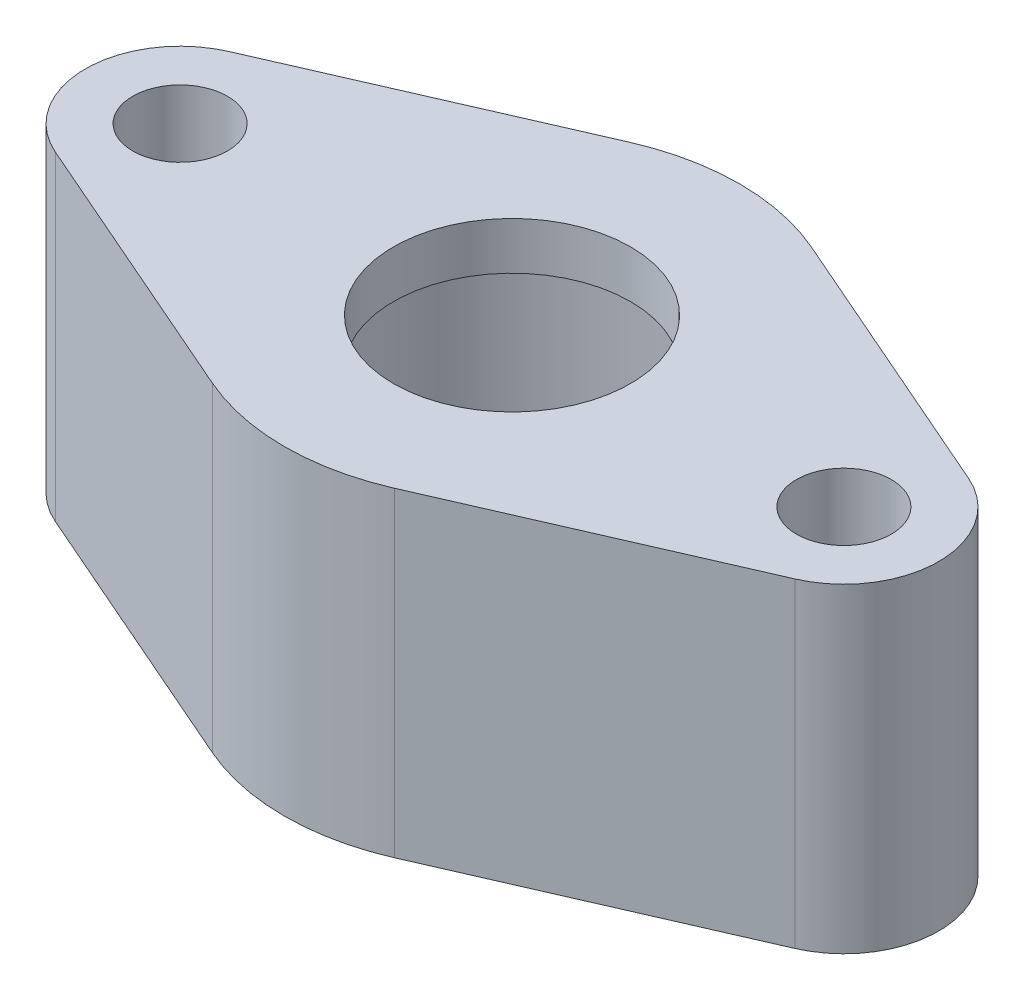
ISO-10303-21;
HEADER;
FILE_DESCRIPTION(('STEP AP214'),'2;1');
FILE_NAME('part.step','',(''),(''),'','','');
FILE_SCHEMA(('AUTOMOTIVE_DESIGN { 1 0 10303 214 1 1 1 1 }'));
ENDSEC;
DATA;
#1=APPLICATION_CONTEXT('core data for automotive mechanical design processes');
#2=APPLICATION_PROTOCOL_DEFINITION('international standard','automotive_design',2000,#1);
#3=PRODUCT_CONTEXT('',#1,'mechanical');
#4=PRODUCT('Part','Part','',(#3));
#5=PRODUCT_RELATED_PRODUCT_CATEGORY('part','',(#4));
#6=PRODUCT_DEFINITION_FORMATION('','',#4);
#7=PRODUCT_DEFINITION_CONTEXT('part definition',#1,'design');
#8=PRODUCT_DEFINITION('design','',#6,#7);
#9=PRODUCT_DEFINITION_SHAPE('','',#8);
#10=(LENGTH_UNIT() NAMED_UNIT(*) SI_UNIT(.MILLI.,.METRE.));
#11=(NAMED_UNIT(*) PLANE_ANGLE_UNIT() SI_UNIT($,.RADIAN.));
#12=(NAMED_UNIT(*) SI_UNIT($,.STERADIAN.) SOLID_ANGLE_UNIT());
#13=UNCERTAINTY_MEASURE_WITH_UNIT(LENGTH_MEASURE(1.E-05),#10,'distance_accuracy_value','');
#14=(GEOMETRIC_REPRESENTATION_CONTEXT(3) GLOBAL_UNCERTAINTY_ASSIGNED_CONTEXT((#13)) GLOBAL_UNIT_ASSIGNED_CONTEXT((#10,
#11,#12)) REPRESENTATION_CONTEXT('',''));
#15=CARTESIAN_POINT('',(0.,0.,0.));
#16=DIRECTION('',(0.,0.,1.));
#17=DIRECTION('',(1.,0.,0.));
#18=AXIS2_PLACEMENT_3D('',#15,#16,#17);
#19=CARTESIAN_POINT('',(-3.84,11.5,-8.79854533431522));
#20=DIRECTION('',(0.4,0.,0.916515138991168));
#21=DIRECTION('',(0.916515138991168,0.,-0.4));
#22=AXIS2_PLACEMENT_3D('',#19,#20,#21);
#23=PLANE('',#22);
#24=DIRECTION('',(-0.916515138991168,0.,0.4));
#25=VECTOR('',#24,1.);
#26=CARTESIAN_POINT('',(-3.84,0.,-8.79854533431522));
#27=LINE('',#26,#25);
#28=CARTESIAN_POINT('',(-3.84,0.,-8.79854533431522));
#29=VERTEX_POINT('',#28);
#30=CARTESIAN_POINT('',(-15.6,0.,-3.66606055596468));
#31=VERTEX_POINT('',#30);
#32=EDGE_CURVE('E143',#29,#31,#27,.T.);
#33=ORIENTED_EDGE('',*,*,#32,.T.);
#34=DIRECTION('',(0.,-1.,0.));
#35=VECTOR('',#34,1.);
#36=CARTESIAN_POINT('',(-15.6,11.5,-3.66606055596468));
#37=LINE('',#36,#35);
#38=CARTESIAN_POINT('',(-15.6,13.5,-3.66606055596468));
#39=VERTEX_POINT('',#38);
#40=EDGE_CURVE('E11',#39,#31,#37,.T.);
#41=ORIENTED_EDGE('',*,*,#40,.F.);
#42=DIRECTION('',(-0.916515138991168,0.,0.4));
#43=VECTOR('',#42,1.);
#44=CARTESIAN_POINT('',(-3.84,13.5,-8.79854533431522));
#45=LINE('',#44,#43);
#46=CARTESIAN_POINT('',(-3.84,13.5,-8.79854533431522));
#47=VERTEX_POINT('',#46);
#48=EDGE_CURVE('E105',#47,#39,#45,.T.);
#49=ORIENTED_EDGE('',*,*,#48,.F.);
#50=DIRECTION('',(0.,-1.,0.));
#51=VECTOR('',#50,1.);
#52=CARTESIAN_POINT('',(-3.84,11.5,-8.79854533431522));
#53=LINE('',#52,#51);
#54=EDGE_CURVE('E94',#47,#29,#53,.T.);
#55=ORIENTED_EDGE('',*,*,#54,.T.);
#56=EDGE_LOOP('',(#33,#41,#49,#55));
#57=FACE_BOUND('',#56,.T.);
#58=ADVANCED_FACE('F34',(#57),#23,.F.);
#59=CARTESIAN_POINT('',(-14.,11.5,0.));
#60=DIRECTION('',(0.,-1.,0.));
#61=DIRECTION('',(0.,0.,-1.));
#62=AXIS2_PLACEMENT_3D('',#59,#60,#61);
#63=CYLINDRICAL_SURFACE('',#62,4.);
#64=CARTESIAN_POINT('',(-14.,0.,0.));
#65=DIRECTION('',(0.,1.,0.));
#66=DIRECTION('',(0.,0.,1.));
#67=AXIS2_PLACEMENT_3D('',#64,#65,#66);
#68=CIRCLE('',#67,4.);
#69=CARTESIAN_POINT('',(-15.6,0.,3.66606055596467));
#70=VERTEX_POINT('',#69);
#71=EDGE_CURVE('E145',#31,#70,#68,.T.);
#72=ORIENTED_EDGE('',*,*,#71,.T.);
#73=DIRECTION('',(0.,-1.,0.));
#74=VECTOR('',#73,1.);
#75=CARTESIAN_POINT('',(-15.6,11.5,3.66606055596467));
#76=LINE('',#75,#74);
#77=CARTESIAN_POINT('',(-15.6,13.5,3.66606055596468));
#78=VERTEX_POINT('',#77);
#79=EDGE_CURVE('E42',#78,#70,#76,.T.);
#80=ORIENTED_EDGE('',*,*,#79,.F.);
#81=CARTESIAN_POINT('',(-14.,13.5,0.));
#82=DIRECTION('',(0.,1.,0.));
#83=DIRECTION('',(0.,0.,1.));
#84=AXIS2_PLACEMENT_3D('',#81,#82,#83);
#85=CIRCLE('',#84,4.);
#86=EDGE_CURVE('E109',#39,#78,#85,.T.);
#87=ORIENTED_EDGE('',*,*,#86,.F.);
#88=ORIENTED_EDGE('',*,*,#40,.T.);
#89=EDGE_LOOP('',(#72,#80,#87,#88));
#90=FACE_BOUND('',#89,.T.);
#91=ADVANCED_FACE('F190',(#90),#63,.T.);
#92=CARTESIAN_POINT('',(-3.84,11.5,8.79854533431521));
#93=DIRECTION('',(0.4,0.,-0.916515138991168));
#94=DIRECTION('',(-0.916515138991168,0.,-0.4));
#95=AXIS2_PLACEMENT_3D('',#92,#93,#94);
#96=PLANE('',#95);
#97=DIRECTION('',(0.916515138991168,0.,0.4));
#98=VECTOR('',#97,1.);
#99=CARTESIAN_POINT('',(-3.84,0.,8.79854533431521));
#100=LINE('',#99,#98);
#101=CARTESIAN_POINT('',(-3.84,0.,8.79854533431521));
#102=VERTEX_POINT('',#101);
#103=EDGE_CURVE('E147',#70,#102,#100,.T.);
#104=ORIENTED_EDGE('',*,*,#103,.T.);
#105=DIRECTION('',(0.,-1.,0.));
#106=VECTOR('',#105,1.);
#107=CARTESIAN_POINT('',(-3.84,11.5,8.79854533431521));
#108=LINE('',#107,#106);
#109=CARTESIAN_POINT('',(-3.84,13.5,8.79854533431521));
#110=VERTEX_POINT('',#109);
#111=EDGE_CURVE('E173',#110,#102,#108,.T.);
#112=ORIENTED_EDGE('',*,*,#111,.F.);
#113=DIRECTION('',(0.916515138991168,0.,0.4));
#114=VECTOR('',#113,1.);
#115=CARTESIAN_POINT('',(-15.6,13.5,3.66606055596467));
#116=LINE('',#115,#114);
#117=EDGE_CURVE('E125',#78,#110,#116,.T.);
#118=ORIENTED_EDGE('',*,*,#117,.F.);
#119=ORIENTED_EDGE('',*,*,#79,.T.);
#120=EDGE_LOOP('',(#104,#112,#118,#119));
#121=FACE_BOUND('',#120,.T.);
#122=ADVANCED_FACE('F179',(#121),#96,.F.);
#123=CARTESIAN_POINT('',(0.,11.5,0.));
#124=DIRECTION('',(0.,-1.,0.));
#125=DIRECTION('',(0.,0.,-1.));
#126=AXIS2_PLACEMENT_3D('',#123,#124,#125);
#127=CYLINDRICAL_SURFACE('',#126,9.6);
#128=CARTESIAN_POINT('',(0.,0.,0.));
#129=DIRECTION('',(0.,1.,0.));
#130=DIRECTION('',(0.,0.,1.));
#131=AXIS2_PLACEMENT_3D('',#128,#129,#130);
#132=CIRCLE('',#131,9.6);
#133=CARTESIAN_POINT('',(3.84,0.,8.79854533431521));
#134=VERTEX_POINT('',#133);
#135=EDGE_CURVE('E149',#102,#134,#132,.T.);
#136=ORIENTED_EDGE('',*,*,#135,.T.);
#137=DIRECTION('',(0.,-1.,0.));
#138=VECTOR('',#137,1.);
#139=CARTESIAN_POINT('',(3.84,11.5,8.79854533431521));
#140=LINE('',#139,#138);
#141=CARTESIAN_POINT('',(3.84,13.5,8.79854533431521));
#142=VERTEX_POINT('',#141);
#143=EDGE_CURVE('E171',#142,#134,#140,.T.);
#144=ORIENTED_EDGE('',*,*,#143,.F.);
#145=CARTESIAN_POINT('',(0.,13.5,0.));
#146=DIRECTION('',(0.,1.,0.));
#147=DIRECTION('',(0.,0.,1.));
#148=AXIS2_PLACEMENT_3D('',#145,#146,#147);
#149=CIRCLE('',#148,9.6);
#150=EDGE_CURVE('E128',#110,#142,#149,.T.);
#151=ORIENTED_EDGE('',*,*,#150,.F.);
#152=ORIENTED_EDGE('',*,*,#111,.T.);
#153=EDGE_LOOP('',(#136,#144,#151,#152));
#154=FACE_BOUND('',#153,.T.);
#155=ADVANCED_FACE('F187',(#154),#127,.T.);
#156=CARTESIAN_POINT('',(3.84,11.5,8.79854533431521));
#157=DIRECTION('',(0.4,0.,0.916515138991168));
#158=DIRECTION('',(0.916515138991168,0.,-0.4));
#159=AXIS2_PLACEMENT_3D('',#156,#157,#158);
#160=PLANE('',#159);
#161=DIRECTION('',(-0.916515138991168,0.,0.4));
#162=VECTOR('',#161,1.);
#163=CARTESIAN_POINT('',(3.84,0.,8.79854533431521));
#164=LINE('',#163,#162);
#165=CARTESIAN_POINT('',(15.6,0.,3.66606055596467));
#166=VERTEX_POINT('',#165);
#167=EDGE_CURVE('E152',#166,#134,#164,.T.);
#168=ORIENTED_EDGE('',*,*,#167,.F.);
#169=DIRECTION('',(0.,-1.,0.));
#170=VECTOR('',#169,1.);
#171=CARTESIAN_POINT('',(15.6,11.5,3.66606055596467));
#172=LINE('',#171,#170);
#173=CARTESIAN_POINT('',(15.6,13.5,3.66606055596467));
#174=VERTEX_POINT('',#173);
#175=EDGE_CURVE('E169',#174,#166,#172,.T.);
#176=ORIENTED_EDGE('',*,*,#175,.F.);
#177=DIRECTION('',(0.916515138991168,0.,-0.4));
#178=VECTOR('',#177,1.);
#179=CARTESIAN_POINT('',(3.84,13.5,8.79854533431521));
#180=LINE('',#179,#178);
#181=EDGE_CURVE('E131',#142,#174,#180,.T.);
#182=ORIENTED_EDGE('',*,*,#181,.F.);
#183=ORIENTED_EDGE('',*,*,#143,.T.);
#184=EDGE_LOOP('',(#168,#176,#182,#183));
#185=FACE_BOUND('',#184,.T.);
#186=ADVANCED_FACE('F199',(#185),#160,.T.);
#187=CARTESIAN_POINT('',(14.,11.5,0.));
#188=DIRECTION('',(0.,-1.,0.));
#189=DIRECTION('',(0.,0.,-1.));
#190=AXIS2_PLACEMENT_3D('',#187,#188,#189);
#191=CYLINDRICAL_SURFACE('',#190,4.);
#192=CARTESIAN_POINT('',(14.,0.,0.));
#193=DIRECTION('',(0.,1.,0.));
#194=DIRECTION('',(0.,0.,1.));
#195=AXIS2_PLACEMENT_3D('',#192,#193,#194);
#196=CIRCLE('',#195,4.);
#197=CARTESIAN_POINT('',(15.6,0.,-3.66606055596467));
#198=VERTEX_POINT('',#197);
#199=EDGE_CURVE('E155',#198,#166,#196,.F.);
#200=ORIENTED_EDGE('',*,*,#199,.F.);
#201=DIRECTION('',(0.,-1.,0.));
#202=VECTOR('',#201,1.);
#203=CARTESIAN_POINT('',(15.6,11.5,-3.66606055596467));
#204=LINE('',#203,#202);
#205=CARTESIAN_POINT('',(15.6,13.5,-3.66606055596467));
#206=VERTEX_POINT('',#205);
#207=EDGE_CURVE('E167',#206,#198,#204,.T.);
#208=ORIENTED_EDGE('',*,*,#207,.F.);
#209=CARTESIAN_POINT('',(14.,13.5,0.));
#210=DIRECTION('',(0.,1.,0.));
#211=DIRECTION('',(0.,0.,1.));
#212=AXIS2_PLACEMENT_3D('',#209,#210,#211);
#213=CIRCLE('',#212,4.);
#214=EDGE_CURVE('E134',#174,#206,#213,.T.);
#215=ORIENTED_EDGE('',*,*,#214,.F.);
#216=ORIENTED_EDGE('',*,*,#175,.T.);
#217=EDGE_LOOP('',(#200,#208,#215,#216));
#218=FACE_BOUND('',#217,.T.);
#219=ADVANCED_FACE('F197',(#218),#191,.T.);
#220=CARTESIAN_POINT('',(3.84,11.5,-8.79854533431521));
#221=DIRECTION('',(0.4,0.,-0.916515138991168));
#222=DIRECTION('',(-0.916515138991168,0.,-0.4));
#223=AXIS2_PLACEMENT_3D('',#220,#221,#222);
#224=PLANE('',#223);
#225=DIRECTION('',(0.916515138991168,0.,0.4));
#226=VECTOR('',#225,1.);
#227=CARTESIAN_POINT('',(3.84,0.,-8.79854533431521));
#228=LINE('',#227,#226);
#229=CARTESIAN_POINT('',(3.84,0.,-8.79854533431521));
#230=VERTEX_POINT('',#229);
#231=EDGE_CURVE('E158',#230,#198,#228,.T.);
#232=ORIENTED_EDGE('',*,*,#231,.F.);
#233=DIRECTION('',(0.,-1.,0.));
#234=VECTOR('',#233,1.);
#235=CARTESIAN_POINT('',(3.84,11.5,-8.79854533431521));
#236=LINE('',#235,#234);
#237=CARTESIAN_POINT('',(3.84,13.5,-8.79854533431521));
#238=VERTEX_POINT('',#237);
#239=EDGE_CURVE('E54',#238,#230,#236,.T.);
#240=ORIENTED_EDGE('',*,*,#239,.F.);
#241=DIRECTION('',(-0.916515138991168,0.,-0.4));
#242=VECTOR('',#241,1.);
#243=CARTESIAN_POINT('',(15.6,13.5,-3.66606055596467));
#244=LINE('',#243,#242);
#245=EDGE_CURVE('E116',#206,#238,#244,.T.);
#246=ORIENTED_EDGE('',*,*,#245,.F.);
#247=ORIENTED_EDGE('',*,*,#207,.T.);
#248=EDGE_LOOP('',(#232,#240,#246,#247));
#249=FACE_BOUND('',#248,.T.);
#250=ADVANCED_FACE('F193',(#249),#224,.T.);
#251=CARTESIAN_POINT('',(0.,11.5,0.));
#252=DIRECTION('',(0.,-1.,0.));
#253=DIRECTION('',(0.,0.,-1.));
#254=AXIS2_PLACEMENT_3D('',#251,#252,#253);
#255=CYLINDRICAL_SURFACE('',#254,7.6);
#256=CARTESIAN_POINT('',(0.,11.5,0.));
#257=DIRECTION('',(0.,1.,0.));
#258=DIRECTION('',(0.,0.,1.));
#259=AXIS2_PLACEMENT_3D('',#256,#257,#258);
#260=CIRCLE('',#259,7.6);
#261=CARTESIAN_POINT('',(0.,11.5,7.6));
#262=VERTEX_POINT('',#261);
#263=EDGE_CURVE('E137',#262,#262,#260,.T.);
#264=ORIENTED_EDGE('',*,*,#263,.T.);
#265=EDGE_LOOP('',(#264));
#266=FACE_BOUND('',#265,.T.);
#267=CARTESIAN_POINT('',(0.,0.,0.));
#268=DIRECTION('',(0.,1.,0.));
#269=DIRECTION('',(0.,0.,1.));
#270=AXIS2_PLACEMENT_3D('',#267,#268,#269);
#271=CIRCLE('',#270,7.6);
#272=CARTESIAN_POINT('',(0.,0.,7.6));
#273=VERTEX_POINT('',#272);
#274=EDGE_CURVE('E161',#273,#273,#271,.T.);
#275=ORIENTED_EDGE('',*,*,#274,.F.);
#276=EDGE_LOOP('',(#275));
#277=FACE_BOUND('',#276,.T.);
#278=ADVANCED_FACE('F245',(#266,#277),#255,.F.);
#279=EDGE_CURVE('E49',#230,#29,#132,.T.);
#280=ORIENTED_EDGE('',*,*,#279,.T.);
#281=ORIENTED_EDGE('',*,*,#54,.F.);
#282=CARTESIAN_POINT('',(0.,13.5,0.));
#283=DIRECTION('',(0.,1.,0.));
#284=DIRECTION('',(0.,0.,1.));
#285=AXIS2_PLACEMENT_3D('',#282,#283,#284);
#286=CIRCLE('',#285,9.6);
#287=EDGE_CURVE('E98',#238,#47,#286,.T.);
#288=ORIENTED_EDGE('',*,*,#287,.F.);
#289=ORIENTED_EDGE('',*,*,#239,.T.);
#290=EDGE_LOOP('',(#280,#281,#288,#289));
#291=FACE_BOUND('',#290,.T.);
#292=ADVANCED_FACE('F96',(#291),#127,.T.);
#293=CARTESIAN_POINT('',(-14.,11.5,0.));
#294=DIRECTION('',(0.,-1.,0.));
#295=DIRECTION('',(0.,0.,-1.));
#296=AXIS2_PLACEMENT_3D('',#293,#294,#295);
#297=CYLINDRICAL_SURFACE('',#296,2.);
#298=CARTESIAN_POINT('',(-14.,0.,0.));
#299=DIRECTION('',(0.,1.,0.));
#300=DIRECTION('',(0.,0.,1.));
#301=AXIS2_PLACEMENT_3D('',#298,#299,#300);
#302=CIRCLE('',#301,2.);
#303=CARTESIAN_POINT('',(-14.,0.,2.));
#304=VERTEX_POINT('',#303);
#305=EDGE_CURVE('E140',#304,#304,#302,.T.);
#306=ORIENTED_EDGE('',*,*,#305,.F.);
#307=EDGE_LOOP('',(#306));
#308=FACE_BOUND('',#307,.T.);
#309=CARTESIAN_POINT('',(-14.,13.5,0.));
#310=DIRECTION('',(0.,1.,0.));
#311=DIRECTION('',(0.,0.,1.));
#312=AXIS2_PLACEMENT_3D('',#309,#310,#311);
#313=CIRCLE('',#312,2.);
#314=CARTESIAN_POINT('',(-14.,13.5,2.));
#315=VERTEX_POINT('',#314);
#316=EDGE_CURVE('E117',#315,#315,#313,.T.);
#317=ORIENTED_EDGE('',*,*,#316,.T.);
#318=EDGE_LOOP('',(#317));
#319=FACE_BOUND('',#318,.T.);
#320=ADVANCED_FACE('F36',(#308,#319),#297,.F.);
#321=CARTESIAN_POINT('',(14.,11.5,0.));
#322=DIRECTION('',(0.,-1.,0.));
#323=DIRECTION('',(0.,0.,-1.));
#324=AXIS2_PLACEMENT_3D('',#321,#322,#323);
#325=CYLINDRICAL_SURFACE('',#324,2.);
#326=CARTESIAN_POINT('',(14.,0.,0.));
#327=DIRECTION('',(0.,1.,0.));
#328=DIRECTION('',(0.,0.,1.));
#329=AXIS2_PLACEMENT_3D('',#326,#327,#328);
#330=CIRCLE('',#329,2.);
#331=CARTESIAN_POINT('',(14.,0.,2.));
#332=VERTEX_POINT('',#331);
#333=EDGE_CURVE('E102',#332,#332,#330,.F.);
#334=ORIENTED_EDGE('',*,*,#333,.T.);
#335=EDGE_LOOP('',(#334));
#336=FACE_BOUND('',#335,.T.);
#337=CARTESIAN_POINT('',(14.,13.5,0.));
#338=DIRECTION('',(0.,1.,0.));
#339=DIRECTION('',(0.,0.,1.));
#340=AXIS2_PLACEMENT_3D('',#337,#338,#339);
#341=CIRCLE('',#340,2.);
#342=CARTESIAN_POINT('',(14.,13.5,2.));
#343=VERTEX_POINT('',#342);
#344=EDGE_CURVE('E120',#343,#343,#341,.T.);
#345=ORIENTED_EDGE('',*,*,#344,.T.);
#346=EDGE_LOOP('',(#345));
#347=FACE_BOUND('',#346,.T.);
#348=ADVANCED_FACE('F264',(#336,#347),#325,.F.);
#349=CARTESIAN_POINT('',(0.,0.,0.));
#350=DIRECTION('',(0.,1.,0.));
#351=DIRECTION('',(0.,0.,1.));
#352=AXIS2_PLACEMENT_3D('',#349,#350,#351);
#353=PLANE('',#352);
#354=ORIENTED_EDGE('',*,*,#305,.T.);
#355=EDGE_LOOP('',(#354));
#356=FACE_BOUND('',#355,.T.);
#357=ORIENTED_EDGE('',*,*,#32,.F.);
#358=ORIENTED_EDGE('',*,*,#279,.F.);
#359=ORIENTED_EDGE('',*,*,#231,.T.);
#360=ORIENTED_EDGE('',*,*,#199,.T.);
#361=ORIENTED_EDGE('',*,*,#167,.T.);
#362=ORIENTED_EDGE('',*,*,#135,.F.);
#363=ORIENTED_EDGE('',*,*,#103,.F.);
#364=ORIENTED_EDGE('',*,*,#71,.F.);
#365=EDGE_LOOP('',(#357,#358,#359,#360,#361,#362,#363,#364));
#366=FACE_BOUND('',#365,.T.);
#367=ORIENTED_EDGE('',*,*,#274,.T.);
#368=EDGE_LOOP('',(#367));
#369=FACE_BOUND('',#368,.T.);
#370=ORIENTED_EDGE('',*,*,#333,.F.);
#371=EDGE_LOOP('',(#370));
#372=FACE_BOUND('',#371,.T.);
#373=ADVANCED_FACE('F183',(#356,#366,#369,#372),#353,.F.);
#374=CARTESIAN_POINT('',(0.,11.5,0.));
#375=DIRECTION('',(0.,1.,0.));
#376=DIRECTION('',(0.,0.,1.));
#377=AXIS2_PLACEMENT_3D('',#374,#375,#376);
#378=PLANE('',#377);
#379=CARTESIAN_POINT('',(0.,11.5,0.));
#380=DIRECTION('',(0.,1.,0.));
#381=DIRECTION('',(0.,0.,1.));
#382=AXIS2_PLACEMENT_3D('',#379,#380,#381);
#383=CIRCLE('',#382,5.);
#384=CARTESIAN_POINT('',(0.,11.5,5.));
#385=VERTEX_POINT('',#384);
#386=EDGE_CURVE('E326',#385,#385,#383,.T.);
#387=ORIENTED_EDGE('',*,*,#386,.T.);
#388=EDGE_LOOP('',(#387));
#389=FACE_BOUND('',#388,.T.);
#390=ORIENTED_EDGE('',*,*,#263,.F.);
#391=EDGE_LOOP('',(#390));
#392=FACE_BOUND('',#391,.T.);
#393=ADVANCED_FACE('F282',(#389,#392),#378,.F.);
#394=CARTESIAN_POINT('',(0.,13.5,0.));
#395=DIRECTION('',(0.,1.,0.));
#396=DIRECTION('',(0.,0.,1.));
#397=AXIS2_PLACEMENT_3D('',#394,#395,#396);
#398=PLANE('',#397);
#399=ORIENTED_EDGE('',*,*,#344,.F.);
#400=EDGE_LOOP('',(#399));
#401=FACE_BOUND('',#400,.T.);
#402=ORIENTED_EDGE('',*,*,#287,.T.);
#403=ORIENTED_EDGE('',*,*,#48,.T.);
#404=ORIENTED_EDGE('',*,*,#86,.T.);
#405=ORIENTED_EDGE('',*,*,#117,.T.);
#406=ORIENTED_EDGE('',*,*,#150,.T.);
#407=ORIENTED_EDGE('',*,*,#181,.T.);
#408=ORIENTED_EDGE('',*,*,#214,.T.);
#409=ORIENTED_EDGE('',*,*,#245,.T.);
#410=EDGE_LOOP('',(#402,#403,#404,#405,#406,#407,#408,#409));
#411=FACE_BOUND('',#410,.T.);
#412=ORIENTED_EDGE('',*,*,#316,.F.);
#413=EDGE_LOOP('',(#412));
#414=FACE_BOUND('',#413,.T.);
#415=CARTESIAN_POINT('',(0.,13.5,0.));
#416=DIRECTION('',(0.,1.,0.));
#417=DIRECTION('',(0.,0.,1.));
#418=AXIS2_PLACEMENT_3D('',#415,#416,#417);
#419=CIRCLE('',#418,5.);
#420=CARTESIAN_POINT('',(0.,13.5,5.));
#421=VERTEX_POINT('',#420);
#422=EDGE_CURVE('E325',#421,#421,#419,.T.);
#423=ORIENTED_EDGE('',*,*,#422,.F.);
#424=EDGE_LOOP('',(#423));
#425=FACE_BOUND('',#424,.T.);
#426=ADVANCED_FACE('F112',(#401,#411,#414,#425),#398,.T.);
#427=CARTESIAN_POINT('',(0.,13.5,0.));
#428=DIRECTION('',(0.,-1.,0.));
#429=DIRECTION('',(0.,0.,-1.));
#430=AXIS2_PLACEMENT_3D('',#427,#428,#429);
#431=CYLINDRICAL_SURFACE('',#430,5.);
#432=ORIENTED_EDGE('',*,*,#422,.T.);
#433=EDGE_LOOP('',(#432));
#434=FACE_BOUND('',#433,.T.);
#435=ORIENTED_EDGE('',*,*,#386,.F.);
#436=EDGE_LOOP('',(#435));
#437=FACE_BOUND('',#436,.T.);
#438=ADVANCED_FACE('F295',(#434,#437),#431,.F.);
#439=CLOSED_SHELL('',(#58,#91,#122,#155,#186,#219,#250,#278,#292,#320,#348,#373,#393,#426,#438));
#440=MANIFOLD_SOLID_BREP('B2',#439);
#441=ADVANCED_BREP_SHAPE_REPRESENTATION('',(#18,#440),#14);
#442=SHAPE_DEFINITION_REPRESENTATION(#9,#441);
ENDSEC;
END-ISO-10303-21;
